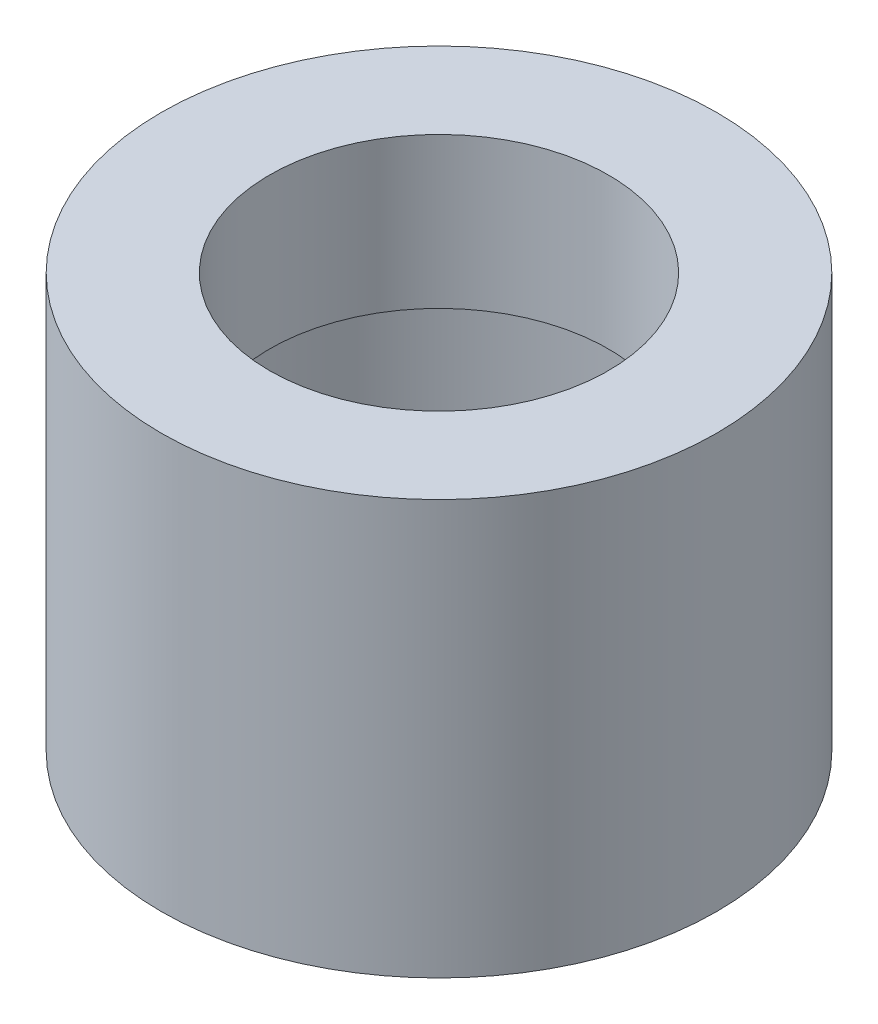
ISO-10303-21;
HEADER;
FILE_DESCRIPTION(('STEP AP214'),'2;1');
FILE_NAME('part.step','',(''),(''),'','','');
FILE_SCHEMA(('AUTOMOTIVE_DESIGN { 1 0 10303 214 1 1 1 1 }'));
ENDSEC;
DATA;
#1=APPLICATION_CONTEXT('core data for automotive mechanical design processes');
#2=APPLICATION_PROTOCOL_DEFINITION('international standard','automotive_design',2000,#1);
#3=PRODUCT_CONTEXT('',#1,'mechanical');
#4=PRODUCT('Part','Part','',(#3));
#5=PRODUCT_RELATED_PRODUCT_CATEGORY('part','',(#4));
#6=PRODUCT_DEFINITION_FORMATION('','',#4);
#7=PRODUCT_DEFINITION_CONTEXT('part definition',#1,'design');
#8=PRODUCT_DEFINITION('design','',#6,#7);
#9=PRODUCT_DEFINITION_SHAPE('','',#8);
#10=(LENGTH_UNIT() NAMED_UNIT(*) SI_UNIT(.MILLI.,.METRE.));
#11=(NAMED_UNIT(*) PLANE_ANGLE_UNIT() SI_UNIT($,.RADIAN.));
#12=(NAMED_UNIT(*) SI_UNIT($,.STERADIAN.) SOLID_ANGLE_UNIT());
#13=UNCERTAINTY_MEASURE_WITH_UNIT(LENGTH_MEASURE(1.E-05),#10,'distance_accuracy_value','');
#14=(GEOMETRIC_REPRESENTATION_CONTEXT(3) GLOBAL_UNCERTAINTY_ASSIGNED_CONTEXT((#13)) GLOBAL_UNIT_ASSIGNED_CONTEXT((#10,
#11,#12)) REPRESENTATION_CONTEXT('',''));
#15=CARTESIAN_POINT('',(0.,0.,0.));
#16=DIRECTION('',(0.,0.,1.));
#17=DIRECTION('',(1.,0.,0.));
#18=AXIS2_PLACEMENT_3D('',#15,#16,#17);
#19=CARTESIAN_POINT('',(0.,-11.,0.));
#20=DIRECTION('',(0.,1.,0.));
#21=DIRECTION('',(0.,0.,1.));
#22=AXIS2_PLACEMENT_3D('',#19,#20,#21);
#23=CYLINDRICAL_SURFACE('',#22,13.);
#24=CARTESIAN_POINT('',(0.,-11.,0.));
#25=DIRECTION('',(0.,1.,0.));
#26=DIRECTION('',(0.,0.,1.));
#27=AXIS2_PLACEMENT_3D('',#24,#25,#26);
#28=CIRCLE('',#27,13.);
#29=CARTESIAN_POINT('',(0.,-11.,13.));
#30=VERTEX_POINT('',#29);
#31=EDGE_CURVE('E55',#30,#30,#28,.T.);
#32=ORIENTED_EDGE('',*,*,#31,.F.);
#33=EDGE_LOOP('',(#32));
#34=FACE_BOUND('',#33,.T.);
#35=CARTESIAN_POINT('',(0.,3.,0.));
#36=DIRECTION('',(0.,1.,0.));
#37=DIRECTION('',(0.,0.,1.));
#38=AXIS2_PLACEMENT_3D('',#35,#36,#37);
#39=CIRCLE('',#38,13.);
#40=CARTESIAN_POINT('',(0.,3.,13.));
#41=VERTEX_POINT('',#40);
#42=EDGE_CURVE('E10',#41,#41,#39,.F.);
#43=ORIENTED_EDGE('',*,*,#42,.F.);
#44=EDGE_LOOP('',(#43));
#45=FACE_BOUND('',#44,.T.);
#46=ADVANCED_FACE('F39',(#34,#45),#23,.F.);
#47=CARTESIAN_POINT('',(0.,-11.,0.));
#48=DIRECTION('',(0.,1.,0.));
#49=DIRECTION('',(0.,0.,1.));
#50=AXIS2_PLACEMENT_3D('',#47,#48,#49);
#51=CYLINDRICAL_SURFACE('',#50,14.75);
#52=CARTESIAN_POINT('',(0.,-11.,0.));
#53=DIRECTION('',(0.,1.,0.));
#54=DIRECTION('',(0.,0.,1.));
#55=AXIS2_PLACEMENT_3D('',#52,#53,#54);
#56=CIRCLE('',#55,14.75);
#57=CARTESIAN_POINT('',(0.,-11.,14.75));
#58=VERTEX_POINT('',#57);
#59=EDGE_CURVE('E46',#58,#58,#56,.T.);
#60=ORIENTED_EDGE('',*,*,#59,.T.);
#61=EDGE_LOOP('',(#60));
#62=FACE_BOUND('',#61,.T.);
#63=CARTESIAN_POINT('',(0.,11.,0.));
#64=DIRECTION('',(0.,1.,0.));
#65=DIRECTION('',(0.,0.,1.));
#66=AXIS2_PLACEMENT_3D('',#63,#64,#65);
#67=CIRCLE('',#66,14.75);
#68=CARTESIAN_POINT('',(0.,11.,14.75));
#69=VERTEX_POINT('',#68);
#70=EDGE_CURVE('E50',#69,#69,#67,.T.);
#71=ORIENTED_EDGE('',*,*,#70,.F.);
#72=EDGE_LOOP('',(#71));
#73=FACE_BOUND('',#72,.T.);
#74=ADVANCED_FACE('F41',(#62,#73),#51,.T.);
#75=CARTESIAN_POINT('',(0.,-11.,0.));
#76=DIRECTION('',(0.,1.,0.));
#77=DIRECTION('',(0.,0.,1.));
#78=AXIS2_PLACEMENT_3D('',#75,#76,#77);
#79=PLANE('',#78);
#80=ORIENTED_EDGE('',*,*,#31,.T.);
#81=EDGE_LOOP('',(#80));
#82=FACE_BOUND('',#81,.T.);
#83=ORIENTED_EDGE('',*,*,#59,.F.);
#84=EDGE_LOOP('',(#83));
#85=FACE_BOUND('',#84,.T.);
#86=ADVANCED_FACE('F76',(#82,#85),#79,.F.);
#87=CARTESIAN_POINT('',(0.,11.,0.));
#88=DIRECTION('',(0.,1.,0.));
#89=DIRECTION('',(0.,0.,1.));
#90=AXIS2_PLACEMENT_3D('',#87,#88,#89);
#91=PLANE('',#90);
#92=ORIENTED_EDGE('',*,*,#70,.T.);
#93=EDGE_LOOP('',(#92));
#94=FACE_BOUND('',#93,.T.);
#95=CARTESIAN_POINT('',(0.,11.,0.));
#96=DIRECTION('',(0.,1.,0.));
#97=DIRECTION('',(0.,0.,1.));
#98=AXIS2_PLACEMENT_3D('',#95,#96,#97);
#99=CIRCLE('',#98,9.);
#100=CARTESIAN_POINT('',(0.,11.,9.));
#101=VERTEX_POINT('',#100);
#102=EDGE_CURVE('E60',#101,#101,#99,.T.);
#103=ORIENTED_EDGE('',*,*,#102,.F.);
#104=EDGE_LOOP('',(#103));
#105=FACE_BOUND('',#104,.T.);
#106=ADVANCED_FACE('F74',(#94,#105),#91,.T.);
#107=CARTESIAN_POINT('',(0.,3.,0.));
#108=DIRECTION('',(0.,1.,0.));
#109=DIRECTION('',(0.,0.,1.));
#110=AXIS2_PLACEMENT_3D('',#107,#108,#109);
#111=PLANE('',#110);
#112=CARTESIAN_POINT('',(0.,3.,0.));
#113=DIRECTION('',(0.,1.,0.));
#114=DIRECTION('',(0.,0.,1.));
#115=AXIS2_PLACEMENT_3D('',#112,#113,#114);
#116=CIRCLE('',#115,9.);
#117=CARTESIAN_POINT('',(0.,3.,9.));
#118=VERTEX_POINT('',#117);
#119=EDGE_CURVE('E59',#118,#118,#116,.T.);
#120=ORIENTED_EDGE('',*,*,#119,.T.);
#121=EDGE_LOOP('',(#120));
#122=FACE_BOUND('',#121,.T.);
#123=ORIENTED_EDGE('',*,*,#42,.T.);
#124=EDGE_LOOP('',(#123));
#125=FACE_BOUND('',#124,.T.);
#126=ADVANCED_FACE('F66',(#122,#125),#111,.F.);
#127=CARTESIAN_POINT('',(0.,3.,0.));
#128=DIRECTION('',(0.,1.,0.));
#129=DIRECTION('',(0.,0.,1.));
#130=AXIS2_PLACEMENT_3D('',#127,#128,#129);
#131=CYLINDRICAL_SURFACE('',#130,9.);
#132=ORIENTED_EDGE('',*,*,#119,.F.);
#133=EDGE_LOOP('',(#132));
#134=FACE_BOUND('',#133,.T.);
#135=ORIENTED_EDGE('',*,*,#102,.T.);
#136=EDGE_LOOP('',(#135));
#137=FACE_BOUND('',#136,.T.);
#138=ADVANCED_FACE('F68',(#134,#137),#131,.F.);
#139=CLOSED_SHELL('',(#46,#74,#86,#106,#126,#138));
#140=MANIFOLD_SOLID_BREP('B2',#139);
#141=ADVANCED_BREP_SHAPE_REPRESENTATION('',(#18,#140),#14);
#142=SHAPE_DEFINITION_REPRESENTATION(#9,#141);
ENDSEC;
END-ISO-10303-21;
